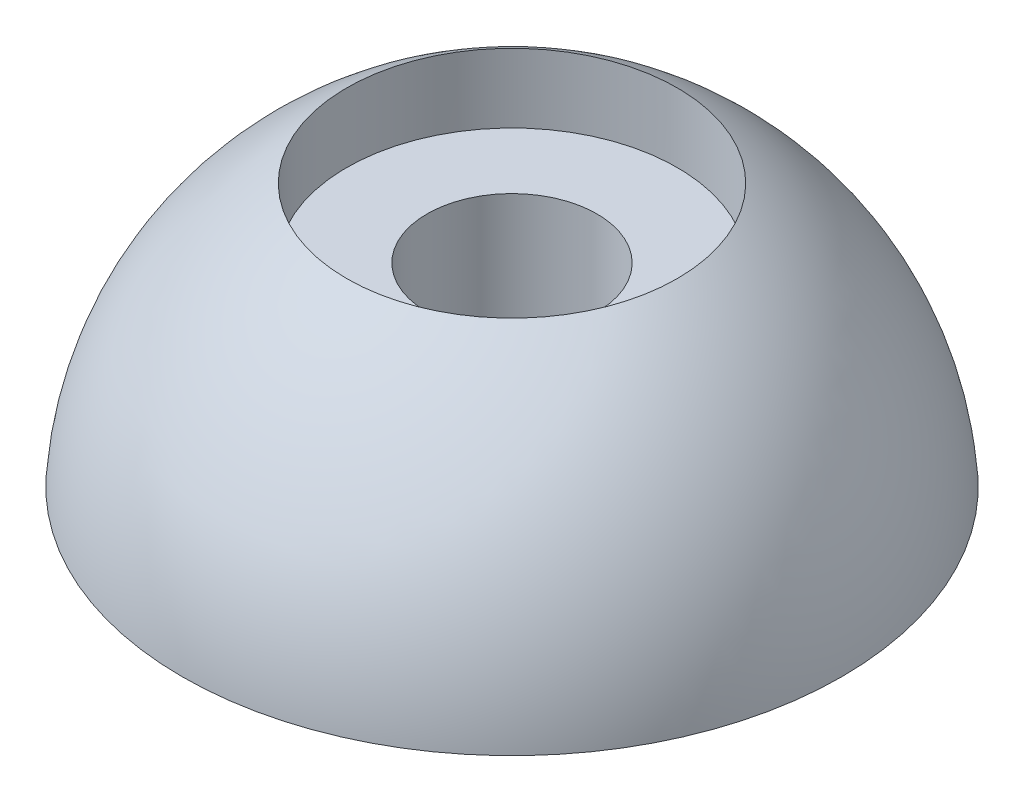
ISO-10303-21;
HEADER;
FILE_DESCRIPTION(('STEP AP214'),'2;1');
FILE_NAME('part.step','',(''),(''),'','','');
FILE_SCHEMA(('AUTOMOTIVE_DESIGN { 1 0 10303 214 1 1 1 1 }'));
ENDSEC;
DATA;
#1=APPLICATION_CONTEXT('core data for automotive mechanical design processes');
#2=APPLICATION_PROTOCOL_DEFINITION('international standard','automotive_design',2000,#1);
#3=PRODUCT_CONTEXT('',#1,'mechanical');
#4=PRODUCT('Part','Part','',(#3));
#5=PRODUCT_RELATED_PRODUCT_CATEGORY('part','',(#4));
#6=PRODUCT_DEFINITION_FORMATION('','',#4);
#7=PRODUCT_DEFINITION_CONTEXT('part definition',#1,'design');
#8=PRODUCT_DEFINITION('design','',#6,#7);
#9=PRODUCT_DEFINITION_SHAPE('','',#8);
#10=(LENGTH_UNIT() NAMED_UNIT(*) SI_UNIT(.MILLI.,.METRE.));
#11=(NAMED_UNIT(*) PLANE_ANGLE_UNIT() SI_UNIT($,.RADIAN.));
#12=(NAMED_UNIT(*) SI_UNIT($,.STERADIAN.) SOLID_ANGLE_UNIT());
#13=UNCERTAINTY_MEASURE_WITH_UNIT(LENGTH_MEASURE(1.E-05),#10,'distance_accuracy_value','');
#14=(GEOMETRIC_REPRESENTATION_CONTEXT(3) GLOBAL_UNCERTAINTY_ASSIGNED_CONTEXT((#13)) GLOBAL_UNIT_ASSIGNED_CONTEXT((#10,
#11,#12)) REPRESENTATION_CONTEXT('',''));
#15=CARTESIAN_POINT('',(0.,0.,0.));
#16=DIRECTION('',(0.,0.,1.));
#17=DIRECTION('',(1.,0.,0.));
#18=AXIS2_PLACEMENT_3D('',#15,#16,#17);
#19=CARTESIAN_POINT('',(0.,0.,0.));
#20=DIRECTION('',(0.,1.,0.));
#21=DIRECTION('',(0.,0.,1.));
#22=AXIS2_PLACEMENT_3D('',#19,#20,#21);
#23=PLANE('',#22);
#24=CARTESIAN_POINT('',(0.,0.,0.));
#25=DIRECTION('',(0.,1.,0.));
#26=DIRECTION('',(0.,0.,1.));
#27=AXIS2_PLACEMENT_3D('',#24,#25,#26);
#28=CIRCLE('',#27,1.8);
#29=CARTESIAN_POINT('',(0.,0.,1.8));
#30=VERTEX_POINT('',#29);
#31=EDGE_CURVE('E40',#30,#30,#28,.T.);
#32=ORIENTED_EDGE('',*,*,#31,.T.);
#33=EDGE_LOOP('',(#32));
#34=FACE_BOUND('',#33,.T.);
#35=CARTESIAN_POINT('',(0.,0.,0.));
#36=DIRECTION('',(0.,1.,0.));
#37=DIRECTION('',(0.,0.,1.));
#38=AXIS2_PLACEMENT_3D('',#35,#36,#37);
#39=CIRCLE('',#38,6.98212002188447);
#40=CARTESIAN_POINT('',(6.98212002188447,0.,0.));
#41=VERTEX_POINT('',#40);
#42=EDGE_CURVE('E10',#41,#41,#39,.T.);
#43=ORIENTED_EDGE('',*,*,#42,.F.);
#44=EDGE_LOOP('',(#43));
#45=FACE_BOUND('',#44,.T.);
#46=ADVANCED_FACE('F30',(#34,#45),#23,.F.);
#47=CARTESIAN_POINT('',(0.,-0.49999999999998,0.));
#48=DIRECTION('',(0.,1.,0.));
#49=DIRECTION('',(1.,0.,0.));
#50=AXIS2_PLACEMENT_3D('',#47,#48,#49);
#51=SPHERICAL_SURFACE('',#50,7.);
#52=CARTESIAN_POINT('',(0.,5.56217782649109,0.));
#53=DIRECTION('',(0.,-1.,0.));
#54=DIRECTION('',(0.,0.,-1.));
#55=AXIS2_PLACEMENT_3D('',#52,#53,#54);
#56=CIRCLE('',#55,3.5);
#57=CARTESIAN_POINT('',(3.5,5.5621778264911,0.));
#58=VERTEX_POINT('',#57);
#59=EDGE_CURVE('E33',#58,#58,#56,.T.);
#60=CARTESIAN_POINT('',(3.5,5.5621778264911,0.));
#61=CARTESIAN_POINT('',(3.56161389875414,5.52660544341469,0.));
#62=CARTESIAN_POINT('',(3.62268510416813,5.49009312614353,0.));
#63=CARTESIAN_POINT('',(3.74368619198574,5.41522391823633,0.));
#64=CARTESIAN_POINT('',(3.80361607438934,5.37686702760028,0.));
#65=CARTESIAN_POINT('',(3.92227857985606,5.29834396798791,0.));
#66=CARTESIAN_POINT('',(3.98101120291917,5.25817779901159,0.));
#67=CARTESIAN_POINT('',(4.09722465066666,5.17607361915486,0.));
#68=CARTESIAN_POINT('',(4.15470547535105,5.13413560827444,0.));
#69=CARTESIAN_POINT('',(4.26836187482546,5.04852670507435,0.));
#70=CARTESIAN_POINT('',(4.32453744961548,5.00485581275468,0.));
#71=CARTESIAN_POINT('',(4.4355311315854,4.91582175105326,0.));
#72=CARTESIAN_POINT('',(4.4903492387653,4.8704585816715,0.));
#73=CARTESIAN_POINT('',(4.59857702426126,4.77808213456126,0.));
#74=CARTESIAN_POINT('',(4.65198670257733,4.73106885683276,0.));
#75=CARTESIAN_POINT('',(4.75734797986332,4.63543589808924,0.));
#76=CARTESIAN_POINT('',(4.80929957883324,4.5868162170742,0.));
#77=CARTESIAN_POINT('',(4.91169640201405,4.48801564953041,0.));
#78=CARTESIAN_POINT('',(4.96214162622493,4.43783476300165,0.));
#79=CARTESIAN_POINT('',(5.06147880493855,4.33595843370366,0.));
#80=CARTESIAN_POINT('',(5.11037075944127,4.28426299093443,0.));
#81=CARTESIAN_POINT('',(5.20655594771437,4.17940560634746,0.));
#82=CARTESIAN_POINT('',(5.25384918148473,4.12624366452971,0.));
#83=CARTESIAN_POINT('',(5.34679296348182,4.01850270233906,0.));
#84=CARTESIAN_POINT('',(5.39244351170855,3.96392368196616,0.));
#85=CARTESIAN_POINT('',(5.48205948488105,3.85339930050219,0.));
#86=CARTESIAN_POINT('',(5.52602490982683,3.79745393941112,0.));
#87=CARTESIAN_POINT('',(5.61222976522773,3.68424888452853,0.));
#88=CARTESIAN_POINT('',(5.65446919568286,3.62698919073702,0.));
#89=CARTESIAN_POINT('',(5.7371827954144,3.51120870030315,0.));
#90=CARTESIAN_POINT('',(5.77765696469081,3.45268790366079,0.));
#91=CARTESIAN_POINT('',(5.85680241640189,3.33443960972338,0.));
#92=CARTESIAN_POINT('',(5.89547369883654,3.27471211242833,0.));
#93=CARTESIAN_POINT('',(5.97097742720364,3.15410594115868,0.));
#94=CARTESIAN_POINT('',(6.00780987313608,3.09322726718408,0.));
#95=CARTESIAN_POINT('',(6.07960168826047,2.97037533668722,0.));
#96=CARTESIAN_POINT('',(6.11456105745242,2.90840208016497,0.));
#97=CARTESIAN_POINT('',(6.18257422011018,2.78341859625231,0.));
#98=CARTESIAN_POINT('',(6.21562801357599,2.7204083688619,0.));
#99=CARTESIAN_POINT('',(6.27979929726029,2.59340951888298,0.));
#100=CARTESIAN_POINT('',(6.31091678747879,2.52942089629447,0.));
#101=CARTESIAN_POINT('',(6.3711865371764,2.40052474112669,0.));
#102=CARTESIAN_POINT('',(6.40033879665551,2.33561720854743,0.));
#103=CARTESIAN_POINT('',(6.45665098430431,2.20494357284421,0.));
#104=CARTESIAN_POINT('',(6.48381091247399,2.13917746972026,0.));
#105=CARTESIAN_POINT('',(6.53611318904431,2.00684783051909,0.));
#106=CARTESIAN_POINT('',(6.56125553744495,1.94028429444187,0.));
#107=CARTESIAN_POINT('',(6.60949928161764,1.80642166823794,0.));
#108=CARTESIAN_POINT('',(6.6326006773897,1.73912257811124,0.));
#109=CARTESIAN_POINT('',(6.6767410407061,1.60385140649366,0.));
#110=CARTESIAN_POINT('',(6.69778000825044,1.53587932500277,0.));
#111=CARTESIAN_POINT('',(6.73777595698908,1.3993253589898,0.));
#112=CARTESIAN_POINT('',(6.75673293818337,1.33074347446771,0.));
#113=CARTESIAN_POINT('',(6.7925472908167,1.19303365753541,0.));
#114=CARTESIAN_POINT('',(6.80940466225575,1.12390572512519,0.));
#115=CARTESIAN_POINT('',(6.84100412658672,0.985168075461203,0.));
#116=CARTESIAN_POINT('',(6.85574621947864,0.915558358207424,0.));
#117=CARTESIAN_POINT('',(6.88310141399181,0.775921848720274,0.));
#118=CARTESIAN_POINT('',(6.89571451561305,0.705895056486904,0.));
#119=CARTESIAN_POINT('',(6.91880003260845,0.565489498575676,0.));
#120=CARTESIAN_POINT('',(6.9292724479826,0.495110732897819,0.));
#121=CARTESIAN_POINT('',(6.94806674351266,0.354066642096204,0.));
#122=CARTESIAN_POINT('',(6.95638862366856,0.283401316972446,0.));
#123=CARTESIAN_POINT('',(6.97087453647616,0.141849842674839,0.));
#124=CARTESIAN_POINT('',(6.97703856912785,0.0709636935009904,0.));
#125=CARTESIAN_POINT('',(6.98212002188447,0.,0.));
#126=B_SPLINE_CURVE_WITH_KNOTS('',3,(#60,#61,#62,#63,#64,#65,#66,#67,#68,#69,#70,#71,#72,#73,
#74,#75,#76,#77,#78,#79,#80,#81,#82,#83,#84,#85,#86,#87,#88,#89,#90,#91,#92,#93,#94,#95,#96,#97,
#98,#99,#100,#101,#102,#103,#104,#105,#106,#107,#108,#109,#110,#111,#112,#113,#114,#115,#116,
#117,#118,#119,#120,#121,#122,#123,#124,#125),.UNSPECIFIED.,.F.,.F.,(4,2,2,2,2,2,2,2,2,2,2,2,2,
2,2,2,2,2,2,2,2,2,2,2,2,2,2,2,2,2,2,2,4),(0.,0.21342787933159,0.426855758663181,
0.640283637994771,0.853711517326362,1.06713939665795,1.28056727598954,1.49399515532113,
1.70742303465272,1.92085091398432,2.13427879331591,2.3477066726475,2.56113455197909,
2.77456243131068,2.98799031064227,3.20141818997386,3.41484606930545,3.62827394863704,
3.84170182796863,4.05512970730022,4.26855758663181,4.4819854659634,4.69541334529499,
4.90884122462658,5.12226910395817,5.33569698328976,5.54912486262136,5.76255274195295,
5.97598062128454,6.18940850061613,6.40283637994772,6.61626425927931,6.8296921386109),.UNSPECIFIED.);
#127=EDGE_CURVE('BSEAM57',#58,#41,#126,.T.);
#128=ORIENTED_EDGE('',*,*,#59,.T.);
#129=ORIENTED_EDGE('',*,*,#42,.T.);
#130=ORIENTED_EDGE('',*,*,#127,.T.);
#131=ORIENTED_EDGE('',*,*,#127,.F.);
#132=EDGE_LOOP('',(#128,#130,#129,#131));
#133=FACE_BOUND('',#132,.T.);
#134=ADVANCED_FACE('F57',(#133),#51,.T.);
#135=CARTESIAN_POINT('',(0.,6.50000000000002,0.));
#136=DIRECTION('',(0.,1.,0.));
#137=DIRECTION('',(0.,0.,1.));
#138=AXIS2_PLACEMENT_3D('',#135,#136,#137);
#139=CYLINDRICAL_SURFACE('',#138,3.5);
#140=CARTESIAN_POINT('',(0.,4.10000000000002,0.));
#141=DIRECTION('',(0.,1.,0.));
#142=DIRECTION('',(0.,0.,1.));
#143=AXIS2_PLACEMENT_3D('',#140,#141,#142);
#144=CIRCLE('',#143,3.5);
#145=CARTESIAN_POINT('',(0.,4.10000000000002,3.5));
#146=VERTEX_POINT('',#145);
#147=EDGE_CURVE('E47',#146,#146,#144,.T.);
#148=ORIENTED_EDGE('',*,*,#147,.F.);
#149=EDGE_LOOP('',(#148));
#150=FACE_BOUND('',#149,.T.);
#151=ORIENTED_EDGE('',*,*,#59,.F.);
#152=EDGE_LOOP('',(#151));
#153=FACE_BOUND('',#152,.T.);
#154=ADVANCED_FACE('F53',(#150,#153),#139,.F.);
#155=CARTESIAN_POINT('',(0.,6.50000000000002,0.));
#156=DIRECTION('',(0.,1.,0.));
#157=DIRECTION('',(0.,0.,1.));
#158=AXIS2_PLACEMENT_3D('',#155,#156,#157);
#159=CYLINDRICAL_SURFACE('',#158,1.8);
#160=ORIENTED_EDGE('',*,*,#31,.F.);
#161=EDGE_LOOP('',(#160));
#162=FACE_BOUND('',#161,.T.);
#163=CARTESIAN_POINT('',(0.,4.10000000000002,0.));
#164=DIRECTION('',(0.,1.,0.));
#165=DIRECTION('',(0.,0.,1.));
#166=AXIS2_PLACEMENT_3D('',#163,#164,#165);
#167=CIRCLE('',#166,1.8);
#168=CARTESIAN_POINT('',(0.,4.10000000000002,1.8));
#169=VERTEX_POINT('',#168);
#170=EDGE_CURVE('E44',#169,#169,#167,.T.);
#171=ORIENTED_EDGE('',*,*,#170,.T.);
#172=EDGE_LOOP('',(#171));
#173=FACE_BOUND('',#172,.T.);
#174=ADVANCED_FACE('F56',(#162,#173),#159,.F.);
#175=CARTESIAN_POINT('',(1.8,4.10000000000002,0.));
#176=DIRECTION('',(0.,-1.,0.));
#177=DIRECTION('',(0.,0.,-1.));
#178=AXIS2_PLACEMENT_3D('',#175,#176,#177);
#179=PLANE('',#178);
#180=ORIENTED_EDGE('',*,*,#170,.F.);
#181=EDGE_LOOP('',(#180));
#182=FACE_BOUND('',#181,.T.);
#183=ORIENTED_EDGE('',*,*,#147,.T.);
#184=EDGE_LOOP('',(#183));
#185=FACE_BOUND('',#184,.T.);
#186=ADVANCED_FACE('F51',(#182,#185),#179,.F.);
#187=CLOSED_SHELL('',(#46,#134,#154,#174,#186));
#188=MANIFOLD_SOLID_BREP('B2',#187);
#189=ADVANCED_BREP_SHAPE_REPRESENTATION('',(#18,#188),#14);
#190=SHAPE_DEFINITION_REPRESENTATION(#9,#189);
ENDSEC;
END-ISO-10303-21;
